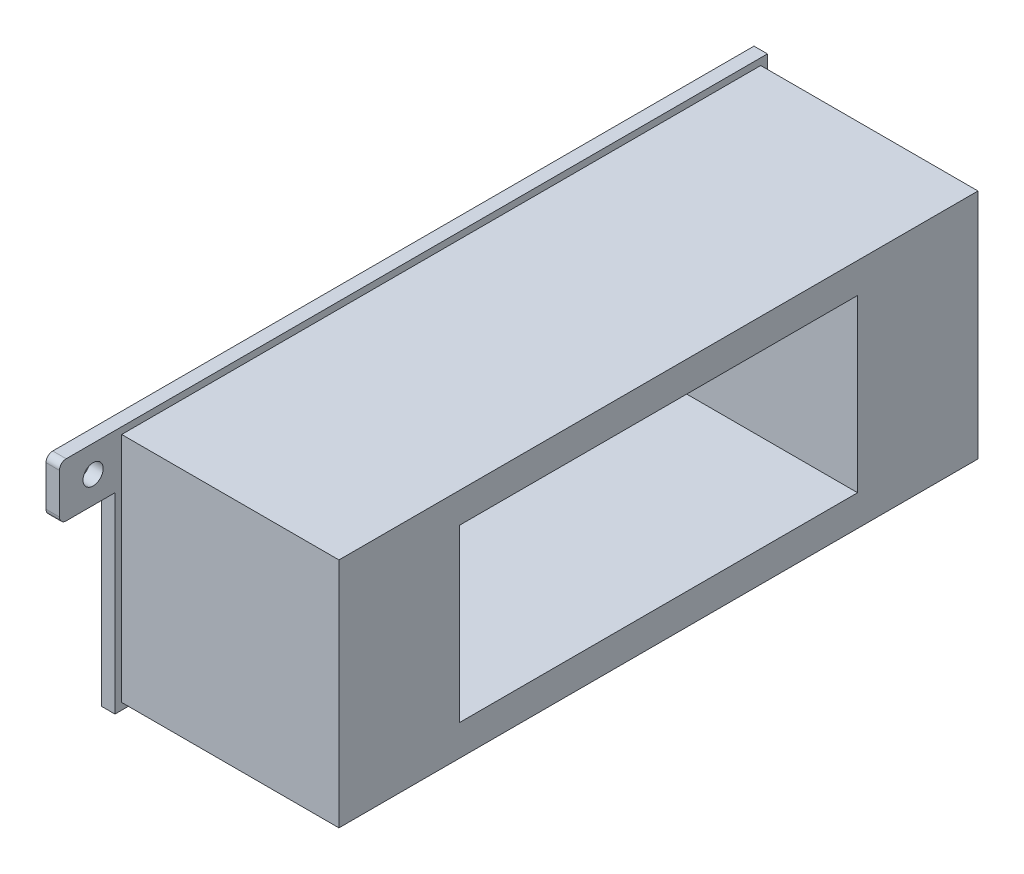
ISO-10303-21;
HEADER;
FILE_DESCRIPTION(('STEP AP214'),'2;1');
FILE_NAME('part.step','',(''),(''),'','','');
FILE_SCHEMA(('AUTOMOTIVE_DESIGN { 1 0 10303 214 1 1 1 1 }'));
ENDSEC;
DATA;
#1=APPLICATION_CONTEXT('core data for automotive mechanical design processes');
#2=APPLICATION_PROTOCOL_DEFINITION('international standard','automotive_design',2000,#1);
#3=PRODUCT_CONTEXT('',#1,'mechanical');
#4=PRODUCT('Part','Part','',(#3));
#5=PRODUCT_RELATED_PRODUCT_CATEGORY('part','',(#4));
#6=PRODUCT_DEFINITION_FORMATION('','',#4);
#7=PRODUCT_DEFINITION_CONTEXT('part definition',#1,'design');
#8=PRODUCT_DEFINITION('design','',#6,#7);
#9=PRODUCT_DEFINITION_SHAPE('','',#8);
#10=(LENGTH_UNIT() NAMED_UNIT(*) SI_UNIT(.MILLI.,.METRE.));
#11=(NAMED_UNIT(*) PLANE_ANGLE_UNIT() SI_UNIT($,.RADIAN.));
#12=(NAMED_UNIT(*) SI_UNIT($,.STERADIAN.) SOLID_ANGLE_UNIT());
#13=UNCERTAINTY_MEASURE_WITH_UNIT(LENGTH_MEASURE(1.E-05),#10,'distance_accuracy_value','');
#14=(GEOMETRIC_REPRESENTATION_CONTEXT(3) GLOBAL_UNCERTAINTY_ASSIGNED_CONTEXT((#13)) GLOBAL_UNIT_ASSIGNED_CONTEXT((#10,
#11,#12)) REPRESENTATION_CONTEXT('',''));
#15=CARTESIAN_POINT('',(0.,0.,0.));
#16=DIRECTION('',(0.,0.,1.));
#17=DIRECTION('',(1.,0.,0.));
#18=AXIS2_PLACEMENT_3D('',#15,#16,#17);
#19=CARTESIAN_POINT('',(0.,0.,95.));
#20=DIRECTION('',(0.,0.,1.));
#21=DIRECTION('',(1.,0.,0.));
#22=AXIS2_PLACEMENT_3D('',#19,#20,#21);
#23=PLANE('',#22);
#24=DIRECTION('',(-1.,0.,0.));
#25=VECTOR('',#24,1.);
#26=CARTESIAN_POINT('',(75.1693222361056,65.889079057492,95.));
#27=LINE('',#26,#25);
#28=CARTESIAN_POINT('',(75.1693222361056,65.889079057492,95.));
#29=VERTEX_POINT('',#28);
#30=CARTESIAN_POINT('',(42.8693222361056,65.889079057492,95.));
#31=VERTEX_POINT('',#30);
#32=EDGE_CURVE('E318',#29,#31,#27,.T.);
#33=ORIENTED_EDGE('',*,*,#32,.T.);
#34=DIRECTION('',(0.,-1.,0.));
#35=VECTOR('',#34,1.);
#36=CARTESIAN_POINT('',(42.8693222361056,66.889079057492,95.));
#37=LINE('',#36,#35);
#38=CARTESIAN_POINT('',(42.8693222361056,31.389079057492,95.));
#39=VERTEX_POINT('',#38);
#40=EDGE_CURVE('E11',#31,#39,#37,.T.);
#41=ORIENTED_EDGE('',*,*,#40,.T.);
#42=DIRECTION('',(1.,0.,0.));
#43=VECTOR('',#42,1.);
#44=CARTESIAN_POINT('',(42.8693222361056,31.389079057492,95.));
#45=LINE('',#44,#43);
#46=CARTESIAN_POINT('',(75.1693222361056,31.389079057492,95.));
#47=VERTEX_POINT('',#46);
#48=EDGE_CURVE('E313',#39,#47,#45,.T.);
#49=ORIENTED_EDGE('',*,*,#48,.T.);
#50=DIRECTION('',(0.,1.,0.));
#51=VECTOR('',#50,1.);
#52=CARTESIAN_POINT('',(75.1693222361056,31.389079057492,95.));
#53=LINE('',#52,#51);
#54=EDGE_CURVE('E315',#47,#29,#53,.T.);
#55=ORIENTED_EDGE('',*,*,#54,.T.);
#56=EDGE_LOOP('',(#33,#41,#49,#55));
#57=FACE_BOUND('',#56,.T.);
#58=ADVANCED_FACE('F36',(#57),#23,.T.);
#59=CARTESIAN_POINT('',(42.8693222361056,66.889079057492,95.));
#60=DIRECTION('',(0.,-1.,0.));
#61=DIRECTION('',(0.,0.,-1.));
#62=AXIS2_PLACEMENT_3D('',#59,#60,#61);
#63=PLANE('',#62);
#64=DIRECTION('',(0.,0.,-1.));
#65=VECTOR('',#64,1.);
#66=CARTESIAN_POINT('',(42.8693222361056,66.889079057492,95.));
#67=LINE('',#66,#65);
#68=CARTESIAN_POINT('',(42.8693222361056,66.889079057492,103.25));
#69=VERTEX_POINT('',#68);
#70=CARTESIAN_POINT('',(42.8693222361056,66.889079057492,-1.));
#71=VERTEX_POINT('',#70);
#72=EDGE_CURVE('E320',#69,#71,#67,.T.);
#73=ORIENTED_EDGE('',*,*,#72,.T.);
#74=DIRECTION('',(-1.,0.,0.));
#75=VECTOR('',#74,1.);
#76=CARTESIAN_POINT('',(42.8693222361056,66.889079057492,-1.));
#77=LINE('',#76,#75);
#78=CARTESIAN_POINT('',(40.8693222361056,66.889079057492,-1.));
#79=VERTEX_POINT('',#78);
#80=EDGE_CURVE('E285',#71,#79,#77,.T.);
#81=ORIENTED_EDGE('',*,*,#80,.T.);
#82=DIRECTION('',(0.,0.,-1.));
#83=VECTOR('',#82,1.);
#84=CARTESIAN_POINT('',(40.8693222361056,66.889079057492,95.));
#85=LINE('',#84,#83);
#86=CARTESIAN_POINT('',(40.8693222361056,66.889079057492,103.25));
#87=VERTEX_POINT('',#86);
#88=EDGE_CURVE('E40',#87,#79,#85,.T.);
#89=ORIENTED_EDGE('',*,*,#88,.F.);
#90=DIRECTION('',(-1.,0.,0.));
#91=VECTOR('',#90,1.);
#92=CARTESIAN_POINT('',(42.8693222361056,66.889079057492,103.25));
#93=LINE('',#92,#91);
#94=EDGE_CURVE('E248',#69,#87,#93,.T.);
#95=ORIENTED_EDGE('',*,*,#94,.F.);
#96=EDGE_LOOP('',(#73,#81,#89,#95));
#97=FACE_BOUND('',#96,.T.);
#98=ADVANCED_FACE('F38',(#97),#63,.F.);
#99=CARTESIAN_POINT('',(40.8693222361056,66.889079057492,95.));
#100=DIRECTION('',(1.,0.,0.));
#101=DIRECTION('',(0.,0.,-1.));
#102=AXIS2_PLACEMENT_3D('',#99,#100,#101);
#103=PLANE('',#102);
#104=DIRECTION('',(0.,0.,1.));
#105=VECTOR('',#104,1.);
#106=CARTESIAN_POINT('',(40.8693222361056,35.989079057492,17.9));
#107=LINE('',#106,#105);
#108=CARTESIAN_POINT('',(40.8693222361056,35.989079057492,17.9));
#109=VERTEX_POINT('',#108);
#110=CARTESIAN_POINT('',(40.8693222361056,35.989079057492,77.08));
#111=VERTEX_POINT('',#110);
#112=EDGE_CURVE('E202',#109,#111,#107,.T.);
#113=ORIENTED_EDGE('',*,*,#112,.F.);
#114=DIRECTION('',(0.,-1.,0.));
#115=VECTOR('',#114,1.);
#116=CARTESIAN_POINT('',(40.8693222361056,35.989079057492,17.9));
#117=LINE('',#116,#115);
#118=CARTESIAN_POINT('',(40.8693222361056,61.389079057492,17.9));
#119=VERTEX_POINT('',#118);
#120=EDGE_CURVE('E53',#119,#109,#117,.T.);
#121=ORIENTED_EDGE('',*,*,#120,.F.);
#122=DIRECTION('',(0.,0.,-1.));
#123=VECTOR('',#122,1.);
#124=CARTESIAN_POINT('',(40.8693222361056,61.389079057492,17.9));
#125=LINE('',#124,#123);
#126=CARTESIAN_POINT('',(40.8693222361056,61.389079057492,77.08));
#127=VERTEX_POINT('',#126);
#128=EDGE_CURVE('E193',#127,#119,#125,.T.);
#129=ORIENTED_EDGE('',*,*,#128,.F.);
#130=DIRECTION('',(0.,1.,0.));
#131=VECTOR('',#130,1.);
#132=CARTESIAN_POINT('',(40.8693222361056,35.989079057492,77.08));
#133=LINE('',#132,#131);
#134=EDGE_CURVE('E196',#111,#127,#133,.T.);
#135=ORIENTED_EDGE('',*,*,#134,.F.);
#136=EDGE_LOOP('',(#113,#121,#129,#135));
#137=FACE_BOUND('',#136,.T.);
#138=ORIENTED_EDGE('',*,*,#88,.T.);
#139=DIRECTION('',(0.,-1.,0.));
#140=VECTOR('',#139,1.);
#141=CARTESIAN_POINT('',(40.8693222361056,38.389079057492,-1.));
#142=LINE('',#141,#140);
#143=CARTESIAN_POINT('',(40.8693222361056,38.389079057492,-1.));
#144=VERTEX_POINT('',#143);
#145=EDGE_CURVE('E265',#79,#144,#142,.T.);
#146=ORIENTED_EDGE('',*,*,#145,.T.);
#147=DIRECTION('',(0.,0.,-1.));
#148=VECTOR('',#147,1.);
#149=CARTESIAN_POINT('',(40.8693222361056,38.389079057492,-1.));
#150=LINE('',#149,#148);
#151=CARTESIAN_POINT('',(40.8693222361056,38.389079057492,-8.24999999999999));
#152=VERTEX_POINT('',#151);
#153=EDGE_CURVE('E288',#144,#152,#150,.T.);
#154=ORIENTED_EDGE('',*,*,#153,.T.);
#155=CARTESIAN_POINT('',(40.8693222361056,37.389079057492,-8.25));
#156=DIRECTION('',(-1.,0.,0.));
#157=DIRECTION('',(0.,0.,-1.));
#158=AXIS2_PLACEMENT_3D('',#155,#156,#157);
#159=CIRCLE('',#158,1.);
#160=CARTESIAN_POINT('',(40.8693222361056,37.389079057492,-9.25));
#161=VERTEX_POINT('',#160);
#162=EDGE_CURVE('E291',#152,#161,#159,.T.);
#163=ORIENTED_EDGE('',*,*,#162,.T.);
#164=DIRECTION('',(0.,-1.,0.));
#165=VECTOR('',#164,1.);
#166=CARTESIAN_POINT('',(40.8693222361056,31.389079057492,-9.25));
#167=LINE('',#166,#165);
#168=CARTESIAN_POINT('',(40.8693222361056,31.389079057492,-9.25));
#169=VERTEX_POINT('',#168);
#170=EDGE_CURVE('E294',#161,#169,#167,.T.);
#171=ORIENTED_EDGE('',*,*,#170,.T.);
#172=CARTESIAN_POINT('',(40.8693222361056,31.389079057492,-8.25));
#173=DIRECTION('',(-1.,0.,0.));
#174=DIRECTION('',(0.,0.,-1.));
#175=AXIS2_PLACEMENT_3D('',#172,#173,#174);
#176=CIRCLE('',#175,1.);
#177=CARTESIAN_POINT('',(40.8693222361056,30.389079057492,-8.24999999999999));
#178=VERTEX_POINT('',#177);
#179=EDGE_CURVE('E273',#169,#178,#176,.T.);
#180=ORIENTED_EDGE('',*,*,#179,.T.);
#181=DIRECTION('',(0.,0.,-1.));
#182=VECTOR('',#181,1.);
#183=CARTESIAN_POINT('',(40.8693222361056,30.389079057492,95.));
#184=LINE('',#183,#182);
#185=CARTESIAN_POINT('',(40.8693222361056,30.389079057492,96.));
#186=VERTEX_POINT('',#185);
#187=EDGE_CURVE('E340',#186,#178,#184,.T.);
#188=ORIENTED_EDGE('',*,*,#187,.F.);
#189=DIRECTION('',(0.,1.,0.));
#190=VECTOR('',#189,1.);
#191=CARTESIAN_POINT('',(40.8693222361056,58.889079057492,96.));
#192=LINE('',#191,#190);
#193=CARTESIAN_POINT('',(40.8693222361056,58.889079057492,96.));
#194=VERTEX_POINT('',#193);
#195=EDGE_CURVE('E215',#186,#194,#192,.T.);
#196=ORIENTED_EDGE('',*,*,#195,.T.);
#197=DIRECTION('',(0.,0.,1.));
#198=VECTOR('',#197,1.);
#199=CARTESIAN_POINT('',(40.8693222361056,58.889079057492,96.));
#200=LINE('',#199,#198);
#201=CARTESIAN_POINT('',(40.8693222361056,58.889079057492,103.25));
#202=VERTEX_POINT('',#201);
#203=EDGE_CURVE('E237',#194,#202,#200,.T.);
#204=ORIENTED_EDGE('',*,*,#203,.T.);
#205=CARTESIAN_POINT('',(40.8693222361056,59.889079057492,103.25));
#206=DIRECTION('',(-1.,0.,0.));
#207=DIRECTION('',(0.,0.,1.));
#208=AXIS2_PLACEMENT_3D('',#205,#206,#207);
#209=CIRCLE('',#208,1.);
#210=CARTESIAN_POINT('',(40.8693222361056,59.889079057492,104.25));
#211=VERTEX_POINT('',#210);
#212=EDGE_CURVE('E240',#202,#211,#209,.T.);
#213=ORIENTED_EDGE('',*,*,#212,.T.);
#214=DIRECTION('',(0.,1.,0.));
#215=VECTOR('',#214,1.);
#216=CARTESIAN_POINT('',(40.8693222361056,65.889079057492,104.25));
#217=LINE('',#216,#215);
#218=CARTESIAN_POINT('',(40.8693222361056,65.889079057492,104.25));
#219=VERTEX_POINT('',#218);
#220=EDGE_CURVE('E243',#211,#219,#217,.T.);
#221=ORIENTED_EDGE('',*,*,#220,.T.);
#222=CARTESIAN_POINT('',(40.8693222361056,65.889079057492,103.25));
#223=DIRECTION('',(-1.,0.,0.));
#224=DIRECTION('',(0.,0.,1.));
#225=AXIS2_PLACEMENT_3D('',#222,#223,#224);
#226=CIRCLE('',#225,1.);
#227=EDGE_CURVE('E222',#219,#87,#226,.T.);
#228=ORIENTED_EDGE('',*,*,#227,.T.);
#229=EDGE_LOOP('',(#138,#146,#154,#163,#171,#180,#188,#196,#204,#213,#221,#228));
#230=FACE_BOUND('',#229,.T.);
#231=CARTESIAN_POINT('',(40.8693222361056,34.389079057492,-4.25));
#232=DIRECTION('',(-1.,0.,0.));
#233=DIRECTION('',(0.,0.,1.));
#234=AXIS2_PLACEMENT_3D('',#231,#232,#233);
#235=CIRCLE('',#234,1.5);
#236=CARTESIAN_POINT('',(40.8693222361056,34.389079057492,-2.75));
#237=VERTEX_POINT('',#236);
#238=EDGE_CURVE('E251',#237,#237,#235,.T.);
#239=ORIENTED_EDGE('',*,*,#238,.F.);
#240=EDGE_LOOP('',(#239));
#241=FACE_BOUND('',#240,.T.);
#242=CARTESIAN_POINT('',(40.8693222361056,62.8890790574922,99.25));
#243=DIRECTION('',(-1.,0.,0.));
#244=DIRECTION('',(0.,0.,1.));
#245=AXIS2_PLACEMENT_3D('',#242,#243,#244);
#246=CIRCLE('',#245,1.5);
#247=CARTESIAN_POINT('',(40.8693222361056,62.8890790574922,100.75));
#248=VERTEX_POINT('',#247);
#249=EDGE_CURVE('E208',#248,#248,#246,.T.);
#250=ORIENTED_EDGE('',*,*,#249,.F.);
#251=EDGE_LOOP('',(#250));
#252=FACE_BOUND('',#251,.T.);
#253=ADVANCED_FACE('F344',(#137,#230,#241,#252),#103,.F.);
#254=CARTESIAN_POINT('',(40.8693222361056,30.389079057492,95.));
#255=DIRECTION('',(0.,1.,0.));
#256=DIRECTION('',(0.,0.,1.));
#257=AXIS2_PLACEMENT_3D('',#254,#255,#256);
#258=PLANE('',#257);
#259=ORIENTED_EDGE('',*,*,#187,.T.);
#260=DIRECTION('',(-1.,0.,0.));
#261=VECTOR('',#260,1.);
#262=CARTESIAN_POINT('',(42.8693222361056,30.389079057492,-8.24999999999999));
#263=LINE('',#262,#261);
#264=CARTESIAN_POINT('',(42.8693222361056,30.389079057492,-8.24999999999999));
#265=VERTEX_POINT('',#264);
#266=EDGE_CURVE('E299',#265,#178,#263,.T.);
#267=ORIENTED_EDGE('',*,*,#266,.F.);
#268=DIRECTION('',(0.,0.,-1.));
#269=VECTOR('',#268,1.);
#270=CARTESIAN_POINT('',(42.8693222361056,30.389079057492,95.));
#271=LINE('',#270,#269);
#272=CARTESIAN_POINT('',(42.8693222361056,30.389079057492,96.));
#273=VERTEX_POINT('',#272);
#274=EDGE_CURVE('E339',#273,#265,#271,.T.);
#275=ORIENTED_EDGE('',*,*,#274,.F.);
#276=DIRECTION('',(-1.,0.,0.));
#277=VECTOR('',#276,1.);
#278=CARTESIAN_POINT('',(42.8693222361056,30.389079057492,96.));
#279=LINE('',#278,#277);
#280=EDGE_CURVE('E234',#273,#186,#279,.T.);
#281=ORIENTED_EDGE('',*,*,#280,.T.);
#282=EDGE_LOOP('',(#259,#267,#275,#281));
#283=FACE_BOUND('',#282,.T.);
#284=ADVANCED_FACE('F372',(#283),#258,.F.);
#285=CARTESIAN_POINT('',(42.8693222361056,31.389079057492,95.));
#286=DIRECTION('',(0.,1.,0.));
#287=DIRECTION('',(0.,0.,1.));
#288=AXIS2_PLACEMENT_3D('',#285,#286,#287);
#289=PLANE('',#288);
#290=DIRECTION('',(1.,0.,0.));
#291=VECTOR('',#290,1.);
#292=CARTESIAN_POINT('',(42.8693222361056,31.389079057492,0.));
#293=LINE('',#292,#291);
#294=CARTESIAN_POINT('',(42.8693222361056,31.389079057492,0.));
#295=VERTEX_POINT('',#294);
#296=CARTESIAN_POINT('',(75.1693222361056,31.389079057492,0.));
#297=VERTEX_POINT('',#296);
#298=EDGE_CURVE('E302',#295,#297,#293,.T.);
#299=ORIENTED_EDGE('',*,*,#298,.T.);
#300=DIRECTION('',(0.,0.,-1.));
#301=VECTOR('',#300,1.);
#302=CARTESIAN_POINT('',(75.1693222361056,31.389079057492,95.));
#303=LINE('',#302,#301);
#304=EDGE_CURVE('E333',#47,#297,#303,.T.);
#305=ORIENTED_EDGE('',*,*,#304,.F.);
#306=ORIENTED_EDGE('',*,*,#48,.F.);
#307=DIRECTION('',(0.,0.,-1.));
#308=VECTOR('',#307,1.);
#309=CARTESIAN_POINT('',(42.8693222361056,31.389079057492,95.));
#310=LINE('',#309,#308);
#311=EDGE_CURVE('E336',#39,#295,#310,.T.);
#312=ORIENTED_EDGE('',*,*,#311,.T.);
#313=EDGE_LOOP('',(#299,#305,#306,#312));
#314=FACE_BOUND('',#313,.T.);
#315=ADVANCED_FACE('F417',(#314),#289,.F.);
#316=CARTESIAN_POINT('',(75.1693222361056,31.389079057492,95.));
#317=DIRECTION('',(-1.,0.,0.));
#318=DIRECTION('',(0.,0.,1.));
#319=AXIS2_PLACEMENT_3D('',#316,#317,#318);
#320=PLANE('',#319);
#321=DIRECTION('',(0.,0.,-1.));
#322=VECTOR('',#321,1.);
#323=CARTESIAN_POINT('',(75.1693222361056,61.389079057492,17.9));
#324=LINE('',#323,#322);
#325=CARTESIAN_POINT('',(75.1693222361056,61.389079057492,77.08));
#326=VERTEX_POINT('',#325);
#327=CARTESIAN_POINT('',(75.1693222361056,61.389079057492,17.9));
#328=VERTEX_POINT('',#327);
#329=EDGE_CURVE('E183',#326,#328,#324,.T.);
#330=ORIENTED_EDGE('',*,*,#329,.T.);
#331=DIRECTION('',(0.,-1.,0.));
#332=VECTOR('',#331,1.);
#333=CARTESIAN_POINT('',(75.1693222361056,35.989079057492,17.9));
#334=LINE('',#333,#332);
#335=CARTESIAN_POINT('',(75.1693222361056,35.989079057492,17.9));
#336=VERTEX_POINT('',#335);
#337=EDGE_CURVE('E177',#328,#336,#334,.T.);
#338=ORIENTED_EDGE('',*,*,#337,.T.);
#339=DIRECTION('',(0.,0.,1.));
#340=VECTOR('',#339,1.);
#341=CARTESIAN_POINT('',(75.1693222361056,35.989079057492,17.9));
#342=LINE('',#341,#340);
#343=CARTESIAN_POINT('',(75.1693222361056,35.989079057492,77.08));
#344=VERTEX_POINT('',#343);
#345=EDGE_CURVE('E186',#336,#344,#342,.T.);
#346=ORIENTED_EDGE('',*,*,#345,.T.);
#347=DIRECTION('',(0.,1.,0.));
#348=VECTOR('',#347,1.);
#349=CARTESIAN_POINT('',(75.1693222361056,35.989079057492,77.08));
#350=LINE('',#349,#348);
#351=EDGE_CURVE('E61',#344,#326,#350,.T.);
#352=ORIENTED_EDGE('',*,*,#351,.T.);
#353=EDGE_LOOP('',(#330,#338,#346,#352));
#354=FACE_BOUND('',#353,.T.);
#355=DIRECTION('',(0.,1.,0.));
#356=VECTOR('',#355,1.);
#357=CARTESIAN_POINT('',(75.1693222361056,31.389079057492,0.));
#358=LINE('',#357,#356);
#359=CARTESIAN_POINT('',(75.1693222361056,65.889079057492,0.));
#360=VERTEX_POINT('',#359);
#361=EDGE_CURVE('E322',#297,#360,#358,.T.);
#362=ORIENTED_EDGE('',*,*,#361,.T.);
#363=DIRECTION('',(0.,0.,-1.));
#364=VECTOR('',#363,1.);
#365=CARTESIAN_POINT('',(75.1693222361056,65.889079057492,95.));
#366=LINE('',#365,#364);
#367=EDGE_CURVE('E330',#29,#360,#366,.T.);
#368=ORIENTED_EDGE('',*,*,#367,.F.);
#369=ORIENTED_EDGE('',*,*,#54,.F.);
#370=ORIENTED_EDGE('',*,*,#304,.T.);
#371=EDGE_LOOP('',(#362,#368,#369,#370));
#372=FACE_BOUND('',#371,.T.);
#373=ADVANCED_FACE('F190',(#354,#372),#320,.F.);
#374=CARTESIAN_POINT('',(75.1693222361056,65.889079057492,95.));
#375=DIRECTION('',(0.,-1.,0.));
#376=DIRECTION('',(0.,0.,-1.));
#377=AXIS2_PLACEMENT_3D('',#374,#375,#376);
#378=PLANE('',#377);
#379=DIRECTION('',(-1.,0.,0.));
#380=VECTOR('',#379,1.);
#381=CARTESIAN_POINT('',(75.1693222361056,65.889079057492,0.));
#382=LINE('',#381,#380);
#383=CARTESIAN_POINT('',(42.8693222361056,65.889079057492,0.));
#384=VERTEX_POINT('',#383);
#385=EDGE_CURVE('E316',#360,#384,#382,.T.);
#386=ORIENTED_EDGE('',*,*,#385,.T.);
#387=DIRECTION('',(0.,0.,-1.));
#388=VECTOR('',#387,1.);
#389=CARTESIAN_POINT('',(42.8693222361056,65.889079057492,95.));
#390=LINE('',#389,#388);
#391=EDGE_CURVE('E327',#31,#384,#390,.T.);
#392=ORIENTED_EDGE('',*,*,#391,.F.);
#393=ORIENTED_EDGE('',*,*,#32,.F.);
#394=ORIENTED_EDGE('',*,*,#367,.T.);
#395=EDGE_LOOP('',(#386,#392,#393,#394));
#396=FACE_BOUND('',#395,.T.);
#397=ADVANCED_FACE('F396',(#396),#378,.F.);
#398=CARTESIAN_POINT('',(42.8693222361056,65.889079057492,95.));
#399=DIRECTION('',(-1.,0.,0.));
#400=DIRECTION('',(0.,0.,1.));
#401=AXIS2_PLACEMENT_3D('',#398,#399,#400);
#402=PLANE('',#401);
#403=ORIENTED_EDGE('',*,*,#72,.F.);
#404=CARTESIAN_POINT('',(42.8693222361056,65.889079057492,103.25));
#405=DIRECTION('',(-1.,0.,0.));
#406=DIRECTION('',(0.,0.,1.));
#407=AXIS2_PLACEMENT_3D('',#404,#405,#406);
#408=CIRCLE('',#407,1.);
#409=CARTESIAN_POINT('',(42.8693222361056,65.889079057492,104.25));
#410=VERTEX_POINT('',#409);
#411=EDGE_CURVE('E231',#410,#69,#408,.T.);
#412=ORIENTED_EDGE('',*,*,#411,.F.);
#413=DIRECTION('',(0.,1.,0.));
#414=VECTOR('',#413,1.);
#415=CARTESIAN_POINT('',(42.8693222361056,65.889079057492,104.25));
#416=LINE('',#415,#414);
#417=CARTESIAN_POINT('',(42.8693222361056,59.889079057492,104.25));
#418=VERTEX_POINT('',#417);
#419=EDGE_CURVE('E228',#418,#410,#416,.T.);
#420=ORIENTED_EDGE('',*,*,#419,.F.);
#421=CARTESIAN_POINT('',(42.8693222361056,59.889079057492,103.25));
#422=DIRECTION('',(-1.,0.,0.));
#423=DIRECTION('',(0.,0.,1.));
#424=AXIS2_PLACEMENT_3D('',#421,#422,#423);
#425=CIRCLE('',#424,1.);
#426=CARTESIAN_POINT('',(42.8693222361056,58.889079057492,103.25));
#427=VERTEX_POINT('',#426);
#428=EDGE_CURVE('E225',#427,#418,#425,.T.);
#429=ORIENTED_EDGE('',*,*,#428,.F.);
#430=DIRECTION('',(0.,0.,1.));
#431=VECTOR('',#430,1.);
#432=CARTESIAN_POINT('',(42.8693222361056,58.889079057492,96.));
#433=LINE('',#432,#431);
#434=CARTESIAN_POINT('',(42.8693222361056,58.889079057492,96.));
#435=VERTEX_POINT('',#434);
#436=EDGE_CURVE('E221',#435,#427,#433,.T.);
#437=ORIENTED_EDGE('',*,*,#436,.F.);
#438=DIRECTION('',(0.,1.,0.));
#439=VECTOR('',#438,1.);
#440=CARTESIAN_POINT('',(42.8693222361056,58.889079057492,96.));
#441=LINE('',#440,#439);
#442=EDGE_CURVE('E218',#273,#435,#441,.T.);
#443=ORIENTED_EDGE('',*,*,#442,.F.);
#444=ORIENTED_EDGE('',*,*,#274,.T.);
#445=CARTESIAN_POINT('',(42.8693222361056,31.389079057492,-8.25));
#446=DIRECTION('',(-1.,0.,0.));
#447=DIRECTION('',(0.,0.,-1.));
#448=AXIS2_PLACEMENT_3D('',#445,#446,#447);
#449=CIRCLE('',#448,1.);
#450=CARTESIAN_POINT('',(42.8693222361056,31.389079057492,-9.25));
#451=VERTEX_POINT('',#450);
#452=EDGE_CURVE('E282',#451,#265,#449,.T.);
#453=ORIENTED_EDGE('',*,*,#452,.F.);
#454=DIRECTION('',(0.,-1.,0.));
#455=VECTOR('',#454,1.);
#456=CARTESIAN_POINT('',(42.8693222361056,31.389079057492,-9.25));
#457=LINE('',#456,#455);
#458=CARTESIAN_POINT('',(42.8693222361056,37.389079057492,-9.25));
#459=VERTEX_POINT('',#458);
#460=EDGE_CURVE('E279',#459,#451,#457,.T.);
#461=ORIENTED_EDGE('',*,*,#460,.F.);
#462=CARTESIAN_POINT('',(42.8693222361056,37.389079057492,-8.25));
#463=DIRECTION('',(-1.,0.,0.));
#464=DIRECTION('',(0.,0.,-1.));
#465=AXIS2_PLACEMENT_3D('',#462,#463,#464);
#466=CIRCLE('',#465,1.);
#467=CARTESIAN_POINT('',(42.8693222361056,38.389079057492,-8.24999999999999));
#468=VERTEX_POINT('',#467);
#469=EDGE_CURVE('E276',#468,#459,#466,.T.);
#470=ORIENTED_EDGE('',*,*,#469,.F.);
#471=DIRECTION('',(0.,0.,-1.));
#472=VECTOR('',#471,1.);
#473=CARTESIAN_POINT('',(42.8693222361056,38.389079057492,-1.));
#474=LINE('',#473,#472);
#475=CARTESIAN_POINT('',(42.8693222361056,38.389079057492,-1.));
#476=VERTEX_POINT('',#475);
#477=EDGE_CURVE('E272',#476,#468,#474,.T.);
#478=ORIENTED_EDGE('',*,*,#477,.F.);
#479=DIRECTION('',(0.,-1.,0.));
#480=VECTOR('',#479,1.);
#481=CARTESIAN_POINT('',(42.8693222361056,38.389079057492,-1.));
#482=LINE('',#481,#480);
#483=EDGE_CURVE('E269',#71,#476,#482,.T.);
#484=ORIENTED_EDGE('',*,*,#483,.F.);
#485=EDGE_LOOP('',(#403,#412,#420,#429,#437,#443,#444,#453,#461,#470,#478,#484));
#486=FACE_BOUND('',#485,.T.);
#487=ORIENTED_EDGE('',*,*,#391,.T.);
#488=DIRECTION('',(0.,1.,0.));
#489=VECTOR('',#488,1.);
#490=CARTESIAN_POINT('',(42.8693222361056,30.389079057492,0.));
#491=LINE('',#490,#489);
#492=EDGE_CURVE('E45',#295,#384,#491,.T.);
#493=ORIENTED_EDGE('',*,*,#492,.F.);
#494=ORIENTED_EDGE('',*,*,#311,.F.);
#495=ORIENTED_EDGE('',*,*,#40,.F.);
#496=EDGE_LOOP('',(#487,#493,#494,#495));
#497=FACE_BOUND('',#496,.T.);
#498=CARTESIAN_POINT('',(42.8693222361056,34.389079057492,-4.25));
#499=DIRECTION('',(-1.,0.,0.));
#500=DIRECTION('',(0.,0.,1.));
#501=AXIS2_PLACEMENT_3D('',#498,#499,#500);
#502=CIRCLE('',#501,1.5);
#503=CARTESIAN_POINT('',(42.8693222361056,34.389079057492,-2.75));
#504=VERTEX_POINT('',#503);
#505=EDGE_CURVE('E262',#504,#504,#502,.T.);
#506=ORIENTED_EDGE('',*,*,#505,.T.);
#507=EDGE_LOOP('',(#506));
#508=FACE_BOUND('',#507,.T.);
#509=CARTESIAN_POINT('',(42.8693222361056,62.8890790574922,99.25));
#510=DIRECTION('',(-1.,0.,0.));
#511=DIRECTION('',(0.,0.,1.));
#512=AXIS2_PLACEMENT_3D('',#509,#510,#511);
#513=CIRCLE('',#512,1.5);
#514=CARTESIAN_POINT('',(42.8693222361056,62.8890790574922,100.75));
#515=VERTEX_POINT('',#514);
#516=EDGE_CURVE('E212',#515,#515,#513,.T.);
#517=ORIENTED_EDGE('',*,*,#516,.T.);
#518=EDGE_LOOP('',(#517));
#519=FACE_BOUND('',#518,.T.);
#520=ADVANCED_FACE('F392',(#486,#497,#508,#519),#402,.F.);
#521=CARTESIAN_POINT('',(0.,0.,0.));
#522=DIRECTION('',(0.,0.,1.));
#523=DIRECTION('',(1.,0.,0.));
#524=AXIS2_PLACEMENT_3D('',#521,#522,#523);
#525=PLANE('',#524);
#526=ORIENTED_EDGE('',*,*,#298,.F.);
#527=ORIENTED_EDGE('',*,*,#492,.T.);
#528=ORIENTED_EDGE('',*,*,#385,.F.);
#529=ORIENTED_EDGE('',*,*,#361,.F.);
#530=EDGE_LOOP('',(#526,#527,#528,#529));
#531=FACE_BOUND('',#530,.T.);
#532=ADVANCED_FACE('F395',(#531),#525,.F.);
#533=CARTESIAN_POINT('',(42.8693222361056,31.389079057492,-8.25));
#534=DIRECTION('',(-1.,0.,0.));
#535=DIRECTION('',(0.,0.,1.));
#536=AXIS2_PLACEMENT_3D('',#533,#534,#535);
#537=CYLINDRICAL_SURFACE('',#536,1.);
#538=ORIENTED_EDGE('',*,*,#179,.F.);
#539=DIRECTION('',(-1.,0.,0.));
#540=VECTOR('',#539,1.);
#541=CARTESIAN_POINT('',(42.8693222361056,31.389079057492,-9.25));
#542=LINE('',#541,#540);
#543=EDGE_CURVE('E303',#451,#169,#542,.T.);
#544=ORIENTED_EDGE('',*,*,#543,.F.);
#545=ORIENTED_EDGE('',*,*,#452,.T.);
#546=ORIENTED_EDGE('',*,*,#266,.T.);
#547=EDGE_LOOP('',(#538,#544,#545,#546));
#548=FACE_BOUND('',#547,.T.);
#549=ADVANCED_FACE('F369',(#548),#537,.T.);
#550=CARTESIAN_POINT('',(42.8693222361056,31.389079057492,-9.25));
#551=DIRECTION('',(0.,0.,-1.));
#552=DIRECTION('',(-1.,0.,0.));
#553=AXIS2_PLACEMENT_3D('',#550,#551,#552);
#554=PLANE('',#553);
#555=ORIENTED_EDGE('',*,*,#170,.F.);
#556=DIRECTION('',(-1.,0.,0.));
#557=VECTOR('',#556,1.);
#558=CARTESIAN_POINT('',(42.8693222361056,37.389079057492,-9.25));
#559=LINE('',#558,#557);
#560=EDGE_CURVE('E305',#459,#161,#559,.T.);
#561=ORIENTED_EDGE('',*,*,#560,.F.);
#562=ORIENTED_EDGE('',*,*,#460,.T.);
#563=ORIENTED_EDGE('',*,*,#543,.T.);
#564=EDGE_LOOP('',(#555,#561,#562,#563));
#565=FACE_BOUND('',#564,.T.);
#566=ADVANCED_FACE('F365',(#565),#554,.T.);
#567=CARTESIAN_POINT('',(42.8693222361056,37.389079057492,-8.25));
#568=DIRECTION('',(-1.,0.,0.));
#569=DIRECTION('',(0.,0.,1.));
#570=AXIS2_PLACEMENT_3D('',#567,#568,#569);
#571=CYLINDRICAL_SURFACE('',#570,1.);
#572=ORIENTED_EDGE('',*,*,#162,.F.);
#573=DIRECTION('',(-1.,0.,0.));
#574=VECTOR('',#573,1.);
#575=CARTESIAN_POINT('',(42.8693222361056,38.389079057492,-8.24999999999999));
#576=LINE('',#575,#574);
#577=EDGE_CURVE('E307',#468,#152,#576,.T.);
#578=ORIENTED_EDGE('',*,*,#577,.F.);
#579=ORIENTED_EDGE('',*,*,#469,.T.);
#580=ORIENTED_EDGE('',*,*,#560,.T.);
#581=EDGE_LOOP('',(#572,#578,#579,#580));
#582=FACE_BOUND('',#581,.T.);
#583=ADVANCED_FACE('F361',(#582),#571,.T.);
#584=CARTESIAN_POINT('',(42.8693222361056,38.389079057492,-1.));
#585=DIRECTION('',(0.,1.,0.));
#586=DIRECTION('',(0.,0.,1.));
#587=AXIS2_PLACEMENT_3D('',#584,#585,#586);
#588=PLANE('',#587);
#589=ORIENTED_EDGE('',*,*,#153,.F.);
#590=DIRECTION('',(-1.,0.,0.));
#591=VECTOR('',#590,1.);
#592=CARTESIAN_POINT('',(42.8693222361056,38.389079057492,-1.));
#593=LINE('',#592,#591);
#594=EDGE_CURVE('E309',#476,#144,#593,.T.);
#595=ORIENTED_EDGE('',*,*,#594,.F.);
#596=ORIENTED_EDGE('',*,*,#477,.T.);
#597=ORIENTED_EDGE('',*,*,#577,.T.);
#598=EDGE_LOOP('',(#589,#595,#596,#597));
#599=FACE_BOUND('',#598,.T.);
#600=ADVANCED_FACE('F357',(#599),#588,.T.);
#601=CARTESIAN_POINT('',(42.8693222361056,38.389079057492,-1.));
#602=DIRECTION('',(0.,0.,-1.));
#603=DIRECTION('',(0.,1.,0.));
#604=AXIS2_PLACEMENT_3D('',#601,#602,#603);
#605=PLANE('',#604);
#606=ORIENTED_EDGE('',*,*,#145,.F.);
#607=ORIENTED_EDGE('',*,*,#80,.F.);
#608=ORIENTED_EDGE('',*,*,#483,.T.);
#609=ORIENTED_EDGE('',*,*,#594,.T.);
#610=EDGE_LOOP('',(#606,#607,#608,#609));
#611=FACE_BOUND('',#610,.T.);
#612=ADVANCED_FACE('F353',(#611),#605,.T.);
#613=CARTESIAN_POINT('',(42.8693222361056,34.389079057492,-4.25));
#614=DIRECTION('',(-1.,0.,0.));
#615=DIRECTION('',(0.,0.,1.));
#616=AXIS2_PLACEMENT_3D('',#613,#614,#615);
#617=CYLINDRICAL_SURFACE('',#616,1.5);
#618=ORIENTED_EDGE('',*,*,#505,.F.);
#619=EDGE_LOOP('',(#618));
#620=FACE_BOUND('',#619,.T.);
#621=ORIENTED_EDGE('',*,*,#238,.T.);
#622=EDGE_LOOP('',(#621));
#623=FACE_BOUND('',#622,.T.);
#624=ADVANCED_FACE('F495',(#620,#623),#617,.F.);
#625=CARTESIAN_POINT('',(42.8693222361056,65.889079057492,103.25));
#626=DIRECTION('',(-1.,0.,0.));
#627=DIRECTION('',(0.,0.,1.));
#628=AXIS2_PLACEMENT_3D('',#625,#626,#627);
#629=CYLINDRICAL_SURFACE('',#628,1.);
#630=ORIENTED_EDGE('',*,*,#227,.F.);
#631=DIRECTION('',(-1.,0.,0.));
#632=VECTOR('',#631,1.);
#633=CARTESIAN_POINT('',(42.8693222361056,65.889079057492,104.25));
#634=LINE('',#633,#632);
#635=EDGE_CURVE('E252',#410,#219,#634,.T.);
#636=ORIENTED_EDGE('',*,*,#635,.F.);
#637=ORIENTED_EDGE('',*,*,#411,.T.);
#638=ORIENTED_EDGE('',*,*,#94,.T.);
#639=EDGE_LOOP('',(#630,#636,#637,#638));
#640=FACE_BOUND('',#639,.T.);
#641=ADVANCED_FACE('F390',(#640),#629,.T.);
#642=CARTESIAN_POINT('',(42.8693222361056,65.889079057492,104.25));
#643=DIRECTION('',(0.,0.,1.));
#644=DIRECTION('',(1.,0.,0.));
#645=AXIS2_PLACEMENT_3D('',#642,#643,#644);
#646=PLANE('',#645);
#647=ORIENTED_EDGE('',*,*,#220,.F.);
#648=DIRECTION('',(-1.,0.,0.));
#649=VECTOR('',#648,1.);
#650=CARTESIAN_POINT('',(42.8693222361056,59.889079057492,104.25));
#651=LINE('',#650,#649);
#652=EDGE_CURVE('E254',#418,#211,#651,.T.);
#653=ORIENTED_EDGE('',*,*,#652,.F.);
#654=ORIENTED_EDGE('',*,*,#419,.T.);
#655=ORIENTED_EDGE('',*,*,#635,.T.);
#656=EDGE_LOOP('',(#647,#653,#654,#655));
#657=FACE_BOUND('',#656,.T.);
#658=ADVANCED_FACE('F387',(#657),#646,.T.);
#659=CARTESIAN_POINT('',(42.8693222361056,59.889079057492,103.25));
#660=DIRECTION('',(-1.,0.,0.));
#661=DIRECTION('',(0.,0.,1.));
#662=AXIS2_PLACEMENT_3D('',#659,#660,#661);
#663=CYLINDRICAL_SURFACE('',#662,1.);
#664=ORIENTED_EDGE('',*,*,#212,.F.);
#665=DIRECTION('',(-1.,0.,0.));
#666=VECTOR('',#665,1.);
#667=CARTESIAN_POINT('',(42.8693222361056,58.889079057492,103.25));
#668=LINE('',#667,#666);
#669=EDGE_CURVE('E256',#427,#202,#668,.T.);
#670=ORIENTED_EDGE('',*,*,#669,.F.);
#671=ORIENTED_EDGE('',*,*,#428,.T.);
#672=ORIENTED_EDGE('',*,*,#652,.T.);
#673=EDGE_LOOP('',(#664,#670,#671,#672));
#674=FACE_BOUND('',#673,.T.);
#675=ADVANCED_FACE('F383',(#674),#663,.T.);
#676=CARTESIAN_POINT('',(42.8693222361056,58.889079057492,96.));
#677=DIRECTION('',(0.,-1.,0.));
#678=DIRECTION('',(0.,0.,-1.));
#679=AXIS2_PLACEMENT_3D('',#676,#677,#678);
#680=PLANE('',#679);
#681=ORIENTED_EDGE('',*,*,#203,.F.);
#682=DIRECTION('',(-1.,0.,0.));
#683=VECTOR('',#682,1.);
#684=CARTESIAN_POINT('',(42.8693222361056,58.889079057492,96.));
#685=LINE('',#684,#683);
#686=EDGE_CURVE('E258',#435,#194,#685,.T.);
#687=ORIENTED_EDGE('',*,*,#686,.F.);
#688=ORIENTED_EDGE('',*,*,#436,.T.);
#689=ORIENTED_EDGE('',*,*,#669,.T.);
#690=EDGE_LOOP('',(#681,#687,#688,#689));
#691=FACE_BOUND('',#690,.T.);
#692=ADVANCED_FACE('F379',(#691),#680,.T.);
#693=CARTESIAN_POINT('',(42.8693222361056,58.889079057492,96.));
#694=DIRECTION('',(0.,0.,1.));
#695=DIRECTION('',(0.,-1.,0.));
#696=AXIS2_PLACEMENT_3D('',#693,#694,#695);
#697=PLANE('',#696);
#698=ORIENTED_EDGE('',*,*,#195,.F.);
#699=ORIENTED_EDGE('',*,*,#280,.F.);
#700=ORIENTED_EDGE('',*,*,#442,.T.);
#701=ORIENTED_EDGE('',*,*,#686,.T.);
#702=EDGE_LOOP('',(#698,#699,#700,#701));
#703=FACE_BOUND('',#702,.T.);
#704=ADVANCED_FACE('F375',(#703),#697,.T.);
#705=CARTESIAN_POINT('',(42.8693222361056,62.8890790574922,99.25));
#706=DIRECTION('',(-1.,0.,0.));
#707=DIRECTION('',(0.,0.,1.));
#708=AXIS2_PLACEMENT_3D('',#705,#706,#707);
#709=CYLINDRICAL_SURFACE('',#708,1.5);
#710=ORIENTED_EDGE('',*,*,#516,.F.);
#711=EDGE_LOOP('',(#710));
#712=FACE_BOUND('',#711,.T.);
#713=ORIENTED_EDGE('',*,*,#249,.T.);
#714=EDGE_LOOP('',(#713));
#715=FACE_BOUND('',#714,.T.);
#716=ADVANCED_FACE('F405',(#712,#715),#709,.F.);
#717=CARTESIAN_POINT('',(75.1693222361056,35.989079057492,17.9));
#718=DIRECTION('',(0.,0.,-1.));
#719=DIRECTION('',(-1.,0.,0.));
#720=AXIS2_PLACEMENT_3D('',#717,#718,#719);
#721=PLANE('',#720);
#722=ORIENTED_EDGE('',*,*,#120,.T.);
#723=DIRECTION('',(-1.,0.,0.));
#724=VECTOR('',#723,1.);
#725=CARTESIAN_POINT('',(75.1693222361056,35.989079057492,17.9));
#726=LINE('',#725,#724);
#727=EDGE_CURVE('E173',#336,#109,#726,.T.);
#728=ORIENTED_EDGE('',*,*,#727,.F.);
#729=ORIENTED_EDGE('',*,*,#337,.F.);
#730=DIRECTION('',(-1.,0.,0.));
#731=VECTOR('',#730,1.);
#732=CARTESIAN_POINT('',(75.1693222361056,61.389079057492,17.9));
#733=LINE('',#732,#731);
#734=EDGE_CURVE('E206',#328,#119,#733,.T.);
#735=ORIENTED_EDGE('',*,*,#734,.T.);
#736=EDGE_LOOP('',(#722,#728,#729,#735));
#737=FACE_BOUND('',#736,.T.);
#738=ADVANCED_FACE('F175',(#737),#721,.F.);
#739=CARTESIAN_POINT('',(75.1693222361056,61.389079057492,17.9));
#740=DIRECTION('',(0.,1.,0.));
#741=DIRECTION('',(0.,0.,1.));
#742=AXIS2_PLACEMENT_3D('',#739,#740,#741);
#743=PLANE('',#742);
#744=ORIENTED_EDGE('',*,*,#128,.T.);
#745=ORIENTED_EDGE('',*,*,#734,.F.);
#746=ORIENTED_EDGE('',*,*,#329,.F.);
#747=DIRECTION('',(-1.,0.,0.));
#748=VECTOR('',#747,1.);
#749=CARTESIAN_POINT('',(75.1693222361056,61.389079057492,77.08));
#750=LINE('',#749,#748);
#751=EDGE_CURVE('E209',#326,#127,#750,.T.);
#752=ORIENTED_EDGE('',*,*,#751,.T.);
#753=EDGE_LOOP('',(#744,#745,#746,#752));
#754=FACE_BOUND('',#753,.T.);
#755=ADVANCED_FACE('F541',(#754),#743,.F.);
#756=CARTESIAN_POINT('',(75.1693222361056,35.989079057492,77.08));
#757=DIRECTION('',(0.,0.,1.));
#758=DIRECTION('',(1.,0.,0.));
#759=AXIS2_PLACEMENT_3D('',#756,#757,#758);
#760=PLANE('',#759);
#761=ORIENTED_EDGE('',*,*,#134,.T.);
#762=ORIENTED_EDGE('',*,*,#751,.F.);
#763=ORIENTED_EDGE('',*,*,#351,.F.);
#764=DIRECTION('',(-1.,0.,0.));
#765=VECTOR('',#764,1.);
#766=CARTESIAN_POINT('',(75.1693222361056,35.989079057492,77.08));
#767=LINE('',#766,#765);
#768=EDGE_CURVE('E182',#344,#111,#767,.T.);
#769=ORIENTED_EDGE('',*,*,#768,.T.);
#770=EDGE_LOOP('',(#761,#762,#763,#769));
#771=FACE_BOUND('',#770,.T.);
#772=ADVANCED_FACE('F548',(#771),#760,.F.);
#773=CARTESIAN_POINT('',(75.1693222361056,35.989079057492,17.9));
#774=DIRECTION('',(0.,-1.,0.));
#775=DIRECTION('',(0.,0.,-1.));
#776=AXIS2_PLACEMENT_3D('',#773,#774,#775);
#777=PLANE('',#776);
#778=ORIENTED_EDGE('',*,*,#112,.T.);
#779=ORIENTED_EDGE('',*,*,#768,.F.);
#780=ORIENTED_EDGE('',*,*,#345,.F.);
#781=ORIENTED_EDGE('',*,*,#727,.T.);
#782=EDGE_LOOP('',(#778,#779,#780,#781));
#783=FACE_BOUND('',#782,.T.);
#784=ADVANCED_FACE('F187',(#783),#777,.F.);
#785=CLOSED_SHELL('',(#58,#98,#253,#284,#315,#373,#397,#520,#532,#549,#566,#583,#600,#612,#624,
#641,#658,#675,#692,#704,#716,#738,#755,#772,#784));
#786=MANIFOLD_SOLID_BREP('B2',#785);
#787=ADVANCED_BREP_SHAPE_REPRESENTATION('',(#18,#786),#14);
#788=SHAPE_DEFINITION_REPRESENTATION(#9,#787);
ENDSEC;
END-ISO-10303-21;
